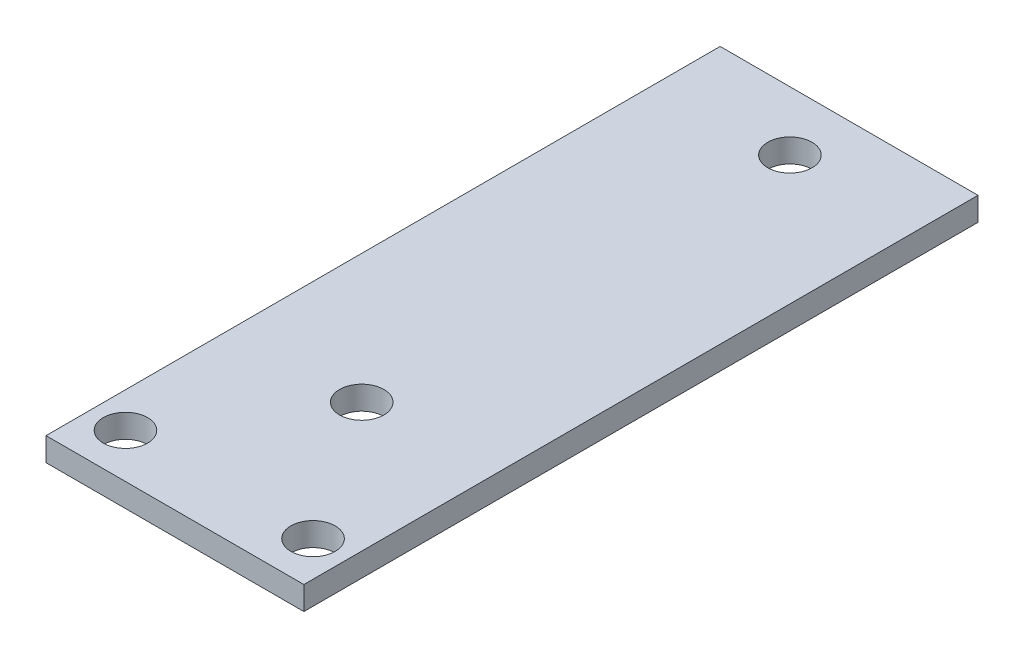
ISO-10303-21;
HEADER;
FILE_DESCRIPTION(('STEP AP214'),'2;1');
FILE_NAME('part.step','',(''),(''),'','','');
FILE_SCHEMA(('AUTOMOTIVE_DESIGN { 1 0 10303 214 1 1 1 1 }'));
ENDSEC;
DATA;
#1=APPLICATION_CONTEXT('core data for automotive mechanical design processes');
#2=APPLICATION_PROTOCOL_DEFINITION('international standard','automotive_design',2000,#1);
#3=PRODUCT_CONTEXT('',#1,'mechanical');
#4=PRODUCT('Part','Part','',(#3));
#5=PRODUCT_RELATED_PRODUCT_CATEGORY('part','',(#4));
#6=PRODUCT_DEFINITION_FORMATION('','',#4);
#7=PRODUCT_DEFINITION_CONTEXT('part definition',#1,'design');
#8=PRODUCT_DEFINITION('design','',#6,#7);
#9=PRODUCT_DEFINITION_SHAPE('','',#8);
#10=(LENGTH_UNIT() NAMED_UNIT(*) SI_UNIT(.MILLI.,.METRE.));
#11=(NAMED_UNIT(*) PLANE_ANGLE_UNIT() SI_UNIT($,.RADIAN.));
#12=(NAMED_UNIT(*) SI_UNIT($,.STERADIAN.) SOLID_ANGLE_UNIT());
#13=UNCERTAINTY_MEASURE_WITH_UNIT(LENGTH_MEASURE(1.E-05),#10,'distance_accuracy_value','');
#14=(GEOMETRIC_REPRESENTATION_CONTEXT(3) GLOBAL_UNCERTAINTY_ASSIGNED_CONTEXT((#13)) GLOBAL_UNIT_ASSIGNED_CONTEXT((#10,
#11,#12)) REPRESENTATION_CONTEXT('',''));
#15=CARTESIAN_POINT('',(0.,0.,0.));
#16=DIRECTION('',(0.,0.,1.));
#17=DIRECTION('',(1.,0.,0.));
#18=AXIS2_PLACEMENT_3D('',#15,#16,#17);
#19=CARTESIAN_POINT('',(0.,3.17499999999999,0.));
#20=DIRECTION('',(0.,-1.,0.));
#21=DIRECTION('',(0.,0.,-1.));
#22=AXIS2_PLACEMENT_3D('',#19,#20,#21);
#23=PLANE('',#22);
#24=CARTESIAN_POINT('',(17.4625,3.17499999999999,-83.29));
#25=DIRECTION('',(0.,-1.,0.));
#26=DIRECTION('',(0.,0.,-1.));
#27=AXIS2_PLACEMENT_3D('',#24,#25,#26);
#28=CIRCLE('',#27,3.);
#29=CARTESIAN_POINT('',(17.4625,3.17499999999999,-86.29));
#30=VERTEX_POINT('',#29);
#31=EDGE_CURVE('E103',#30,#30,#28,.T.);
#32=ORIENTED_EDGE('',*,*,#31,.T.);
#33=EDGE_LOOP('',(#32));
#34=FACE_BOUND('',#33,.T.);
#35=CARTESIAN_POINT('',(17.4625,3.17499999999999,-25.3));
#36=DIRECTION('',(0.,-1.,0.));
#37=DIRECTION('',(0.,0.,-1.));
#38=AXIS2_PLACEMENT_3D('',#35,#36,#37);
#39=CIRCLE('',#38,3.);
#40=CARTESIAN_POINT('',(17.4625,3.17499999999999,-28.3));
#41=VERTEX_POINT('',#40);
#42=EDGE_CURVE('E108',#41,#41,#39,.T.);
#43=ORIENTED_EDGE('',*,*,#42,.T.);
#44=EDGE_LOOP('',(#43));
#45=FACE_BOUND('',#44,.T.);
#46=CARTESIAN_POINT('',(4.76249999999999,3.17499999999999,-6.));
#47=DIRECTION('',(0.,-1.,0.));
#48=DIRECTION('',(0.,0.,-1.));
#49=AXIS2_PLACEMENT_3D('',#46,#47,#48);
#50=CIRCLE('',#49,3.);
#51=CARTESIAN_POINT('',(4.76249999999999,3.17499999999999,-9.00000000000001));
#52=VERTEX_POINT('',#51);
#53=EDGE_CURVE('E112',#52,#52,#50,.T.);
#54=ORIENTED_EDGE('',*,*,#53,.T.);
#55=EDGE_LOOP('',(#54));
#56=FACE_BOUND('',#55,.T.);
#57=CARTESIAN_POINT('',(30.1625,3.17499999999999,-6.));
#58=DIRECTION('',(0.,-1.,0.));
#59=DIRECTION('',(0.,0.,-1.));
#60=AXIS2_PLACEMENT_3D('',#57,#58,#59);
#61=CIRCLE('',#60,3.);
#62=CARTESIAN_POINT('',(30.1625,3.17499999999999,-9.));
#63=VERTEX_POINT('',#62);
#64=EDGE_CURVE('E96',#63,#63,#61,.T.);
#65=ORIENTED_EDGE('',*,*,#64,.T.);
#66=EDGE_LOOP('',(#65));
#67=FACE_BOUND('',#66,.T.);
#68=DIRECTION('',(1.,0.,0.));
#69=VECTOR('',#68,1.);
#70=CARTESIAN_POINT('',(0.,3.17499999999999,-91.3));
#71=LINE('',#70,#69);
#72=CARTESIAN_POINT('',(0.,3.17499999999999,-91.3));
#73=VERTEX_POINT('',#72);
#74=CARTESIAN_POINT('',(34.925,3.17499999999999,-91.3));
#75=VERTEX_POINT('',#74);
#76=EDGE_CURVE('E78',#73,#75,#71,.T.);
#77=ORIENTED_EDGE('',*,*,#76,.F.);
#78=DIRECTION('',(0.,0.,1.));
#79=VECTOR('',#78,1.);
#80=CARTESIAN_POINT('',(0.,3.17499999999999,-115.));
#81=LINE('',#80,#79);
#82=CARTESIAN_POINT('',(0.,3.17499999999999,0.));
#83=VERTEX_POINT('',#82);
#84=EDGE_CURVE('E61',#73,#83,#81,.T.);
#85=ORIENTED_EDGE('',*,*,#84,.T.);
#86=DIRECTION('',(1.,0.,0.));
#87=VECTOR('',#86,1.);
#88=CARTESIAN_POINT('',(0.,3.17499999999999,0.));
#89=LINE('',#88,#87);
#90=CARTESIAN_POINT('',(34.925,3.17499999999999,0.));
#91=VERTEX_POINT('',#90);
#92=EDGE_CURVE('E98',#83,#91,#89,.T.);
#93=ORIENTED_EDGE('',*,*,#92,.T.);
#94=DIRECTION('',(0.,0.,1.));
#95=VECTOR('',#94,1.);
#96=CARTESIAN_POINT('',(34.925,3.17499999999999,-115.));
#97=LINE('',#96,#95);
#98=EDGE_CURVE('E44',#75,#91,#97,.T.);
#99=ORIENTED_EDGE('',*,*,#98,.F.);
#100=EDGE_LOOP('',(#77,#85,#93,#99));
#101=FACE_BOUND('',#100,.T.);
#102=ADVANCED_FACE('F41',(#34,#45,#56,#67,#101),#23,.F.);
#103=CARTESIAN_POINT('',(34.925,3.17499999999999,-115.));
#104=DIRECTION('',(1.,0.,0.));
#105=DIRECTION('',(0.,0.,-1.));
#106=AXIS2_PLACEMENT_3D('',#103,#104,#105);
#107=PLANE('',#106);
#108=DIRECTION('',(0.,-1.,0.));
#109=VECTOR('',#108,1.);
#110=CARTESIAN_POINT('',(34.925,3.17499999999999,-91.3));
#111=LINE('',#110,#109);
#112=CARTESIAN_POINT('',(34.925,0.,-91.3));
#113=VERTEX_POINT('',#112);
#114=EDGE_CURVE('E81',#75,#113,#111,.T.);
#115=ORIENTED_EDGE('',*,*,#114,.F.);
#116=ORIENTED_EDGE('',*,*,#98,.T.);
#117=DIRECTION('',(0.,-1.,0.));
#118=VECTOR('',#117,1.);
#119=CARTESIAN_POINT('',(34.925,3.17499999999999,0.));
#120=LINE('',#119,#118);
#121=CARTESIAN_POINT('',(34.925,0.,0.));
#122=VERTEX_POINT('',#121);
#123=EDGE_CURVE('E102',#91,#122,#120,.T.);
#124=ORIENTED_EDGE('',*,*,#123,.T.);
#125=DIRECTION('',(0.,0.,-1.));
#126=VECTOR('',#125,1.);
#127=CARTESIAN_POINT('',(34.925,0.,5.));
#128=LINE('',#127,#126);
#129=EDGE_CURVE('E92',#122,#113,#128,.T.);
#130=ORIENTED_EDGE('',*,*,#129,.T.);
#131=EDGE_LOOP('',(#115,#116,#124,#130));
#132=FACE_BOUND('',#131,.T.);
#133=ADVANCED_FACE('F43',(#132),#107,.T.);
#134=CARTESIAN_POINT('',(0.,0.,5.));
#135=DIRECTION('',(0.,1.,0.));
#136=DIRECTION('',(0.,0.,1.));
#137=AXIS2_PLACEMENT_3D('',#134,#135,#136);
#138=PLANE('',#137);
#139=CARTESIAN_POINT('',(17.4625,0.,-83.29));
#140=DIRECTION('',(0.,-1.,0.));
#141=DIRECTION('',(0.,0.,-1.));
#142=AXIS2_PLACEMENT_3D('',#139,#140,#141);
#143=CIRCLE('',#142,3.);
#144=CARTESIAN_POINT('',(17.4625,0.,-86.29));
#145=VERTEX_POINT('',#144);
#146=EDGE_CURVE('E104',#145,#145,#143,.T.);
#147=ORIENTED_EDGE('',*,*,#146,.F.);
#148=EDGE_LOOP('',(#147));
#149=FACE_BOUND('',#148,.T.);
#150=CARTESIAN_POINT('',(17.4625,0.,-25.3));
#151=DIRECTION('',(0.,-1.,0.));
#152=DIRECTION('',(0.,0.,-1.));
#153=AXIS2_PLACEMENT_3D('',#150,#151,#152);
#154=CIRCLE('',#153,3.);
#155=CARTESIAN_POINT('',(17.4625,0.,-28.3));
#156=VERTEX_POINT('',#155);
#157=EDGE_CURVE('E111',#156,#156,#154,.T.);
#158=ORIENTED_EDGE('',*,*,#157,.F.);
#159=EDGE_LOOP('',(#158));
#160=FACE_BOUND('',#159,.T.);
#161=CARTESIAN_POINT('',(4.76249999999999,0.,-6.));
#162=DIRECTION('',(0.,-1.,0.));
#163=DIRECTION('',(0.,0.,-1.));
#164=AXIS2_PLACEMENT_3D('',#161,#162,#163);
#165=CIRCLE('',#164,3.);
#166=CARTESIAN_POINT('',(4.76249999999999,0.,-9.00000000000001));
#167=VERTEX_POINT('',#166);
#168=EDGE_CURVE('E120',#167,#167,#165,.T.);
#169=ORIENTED_EDGE('',*,*,#168,.F.);
#170=EDGE_LOOP('',(#169));
#171=FACE_BOUND('',#170,.T.);
#172=CARTESIAN_POINT('',(30.1625,0.,-6.));
#173=DIRECTION('',(0.,-1.,0.));
#174=DIRECTION('',(0.,0.,-1.));
#175=AXIS2_PLACEMENT_3D('',#172,#173,#174);
#176=CIRCLE('',#175,3.);
#177=CARTESIAN_POINT('',(30.1625,0.,-9.));
#178=VERTEX_POINT('',#177);
#179=EDGE_CURVE('E119',#178,#178,#176,.T.);
#180=ORIENTED_EDGE('',*,*,#179,.F.);
#181=EDGE_LOOP('',(#180));
#182=FACE_BOUND('',#181,.T.);
#183=DIRECTION('',(0.,0.,-1.));
#184=VECTOR('',#183,1.);
#185=CARTESIAN_POINT('',(0.,0.,5.));
#186=LINE('',#185,#184);
#187=CARTESIAN_POINT('',(0.,0.,0.));
#188=VERTEX_POINT('',#187);
#189=CARTESIAN_POINT('',(0.,0.,-91.3));
#190=VERTEX_POINT('',#189);
#191=EDGE_CURVE('E11',#188,#190,#186,.T.);
#192=ORIENTED_EDGE('',*,*,#191,.T.);
#193=DIRECTION('',(1.,0.,0.));
#194=VECTOR('',#193,1.);
#195=CARTESIAN_POINT('',(0.,0.,-91.3));
#196=LINE('',#195,#194);
#197=EDGE_CURVE('E86',#190,#113,#196,.T.);
#198=ORIENTED_EDGE('',*,*,#197,.T.);
#199=ORIENTED_EDGE('',*,*,#129,.F.);
#200=DIRECTION('',(1.,0.,0.));
#201=VECTOR('',#200,1.);
#202=CARTESIAN_POINT('',(0.,0.,0.));
#203=LINE('',#202,#201);
#204=EDGE_CURVE('E93',#188,#122,#203,.T.);
#205=ORIENTED_EDGE('',*,*,#204,.F.);
#206=EDGE_LOOP('',(#192,#198,#199,#205));
#207=FACE_BOUND('',#206,.T.);
#208=ADVANCED_FACE('F132',(#149,#160,#171,#182,#207),#138,.F.);
#209=CARTESIAN_POINT('',(0.,3.17499999999999,-115.));
#210=DIRECTION('',(1.,0.,0.));
#211=DIRECTION('',(0.,0.,-1.));
#212=AXIS2_PLACEMENT_3D('',#209,#210,#211);
#213=PLANE('',#212);
#214=ORIENTED_EDGE('',*,*,#84,.F.);
#215=DIRECTION('',(0.,-1.,0.));
#216=VECTOR('',#215,1.);
#217=CARTESIAN_POINT('',(0.,3.17499999999999,-91.3));
#218=LINE('',#217,#216);
#219=EDGE_CURVE('E57',#73,#190,#218,.T.);
#220=ORIENTED_EDGE('',*,*,#219,.T.);
#221=ORIENTED_EDGE('',*,*,#191,.F.);
#222=DIRECTION('',(0.,-1.,0.));
#223=VECTOR('',#222,1.);
#224=CARTESIAN_POINT('',(0.,3.17499999999999,0.));
#225=LINE('',#224,#223);
#226=EDGE_CURVE('E123',#83,#188,#225,.T.);
#227=ORIENTED_EDGE('',*,*,#226,.F.);
#228=EDGE_LOOP('',(#214,#220,#221,#227));
#229=FACE_BOUND('',#228,.T.);
#230=ADVANCED_FACE('F136',(#229),#213,.F.);
#231=CARTESIAN_POINT('',(17.4625,3.17499999999999,-83.29));
#232=DIRECTION('',(0.,-1.,0.));
#233=DIRECTION('',(0.,0.,-1.));
#234=AXIS2_PLACEMENT_3D('',#231,#232,#233);
#235=CYLINDRICAL_SURFACE('',#234,3.);
#236=ORIENTED_EDGE('',*,*,#31,.F.);
#237=EDGE_LOOP('',(#236));
#238=FACE_BOUND('',#237,.T.);
#239=ORIENTED_EDGE('',*,*,#146,.T.);
#240=EDGE_LOOP('',(#239));
#241=FACE_BOUND('',#240,.T.);
#242=ADVANCED_FACE('F161',(#238,#241),#235,.F.);
#243=CARTESIAN_POINT('',(17.4625,3.17499999999999,-25.3));
#244=DIRECTION('',(0.,-1.,0.));
#245=DIRECTION('',(0.,0.,-1.));
#246=AXIS2_PLACEMENT_3D('',#243,#244,#245);
#247=CYLINDRICAL_SURFACE('',#246,3.);
#248=ORIENTED_EDGE('',*,*,#42,.F.);
#249=EDGE_LOOP('',(#248));
#250=FACE_BOUND('',#249,.T.);
#251=ORIENTED_EDGE('',*,*,#157,.T.);
#252=EDGE_LOOP('',(#251));
#253=FACE_BOUND('',#252,.T.);
#254=ADVANCED_FACE('F168',(#250,#253),#247,.F.);
#255=CARTESIAN_POINT('',(4.76249999999999,3.17499999999999,-6.));
#256=DIRECTION('',(0.,-1.,0.));
#257=DIRECTION('',(0.,0.,-1.));
#258=AXIS2_PLACEMENT_3D('',#255,#256,#257);
#259=CYLINDRICAL_SURFACE('',#258,3.);
#260=ORIENTED_EDGE('',*,*,#53,.F.);
#261=EDGE_LOOP('',(#260));
#262=FACE_BOUND('',#261,.T.);
#263=ORIENTED_EDGE('',*,*,#168,.T.);
#264=EDGE_LOOP('',(#263));
#265=FACE_BOUND('',#264,.T.);
#266=ADVANCED_FACE('F149',(#262,#265),#259,.F.);
#267=CARTESIAN_POINT('',(30.1625,3.17499999999999,-6.));
#268=DIRECTION('',(0.,-1.,0.));
#269=DIRECTION('',(0.,0.,-1.));
#270=AXIS2_PLACEMENT_3D('',#267,#268,#269);
#271=CYLINDRICAL_SURFACE('',#270,3.);
#272=ORIENTED_EDGE('',*,*,#64,.F.);
#273=EDGE_LOOP('',(#272));
#274=FACE_BOUND('',#273,.T.);
#275=ORIENTED_EDGE('',*,*,#179,.T.);
#276=EDGE_LOOP('',(#275));
#277=FACE_BOUND('',#276,.T.);
#278=ADVANCED_FACE('F142',(#274,#277),#271,.F.);
#279=CARTESIAN_POINT('',(0.,3.17499999999999,0.));
#280=DIRECTION('',(0.,0.,-1.));
#281=DIRECTION('',(-1.,0.,0.));
#282=AXIS2_PLACEMENT_3D('',#279,#280,#281);
#283=PLANE('',#282);
#284=ORIENTED_EDGE('',*,*,#204,.T.);
#285=ORIENTED_EDGE('',*,*,#123,.F.);
#286=ORIENTED_EDGE('',*,*,#92,.F.);
#287=ORIENTED_EDGE('',*,*,#226,.T.);
#288=EDGE_LOOP('',(#284,#285,#286,#287));
#289=FACE_BOUND('',#288,.T.);
#290=ADVANCED_FACE('F138',(#289),#283,.F.);
#291=CARTESIAN_POINT('',(0.,3.17499999999999,-91.3));
#292=DIRECTION('',(0.,0.,-1.));
#293=DIRECTION('',(-1.,0.,0.));
#294=AXIS2_PLACEMENT_3D('',#291,#292,#293);
#295=PLANE('',#294);
#296=ORIENTED_EDGE('',*,*,#197,.F.);
#297=ORIENTED_EDGE('',*,*,#219,.F.);
#298=ORIENTED_EDGE('',*,*,#76,.T.);
#299=ORIENTED_EDGE('',*,*,#114,.T.);
#300=EDGE_LOOP('',(#296,#297,#298,#299));
#301=FACE_BOUND('',#300,.T.);
#302=ADVANCED_FACE('F85',(#301),#295,.T.);
#303=CLOSED_SHELL('',(#102,#133,#208,#230,#242,#254,#266,#278,#290,#302));
#304=MANIFOLD_SOLID_BREP('B2',#303);
#305=ADVANCED_BREP_SHAPE_REPRESENTATION('',(#18,#304),#14);
#306=SHAPE_DEFINITION_REPRESENTATION(#9,#305);
ENDSEC;
END-ISO-10303-21;
